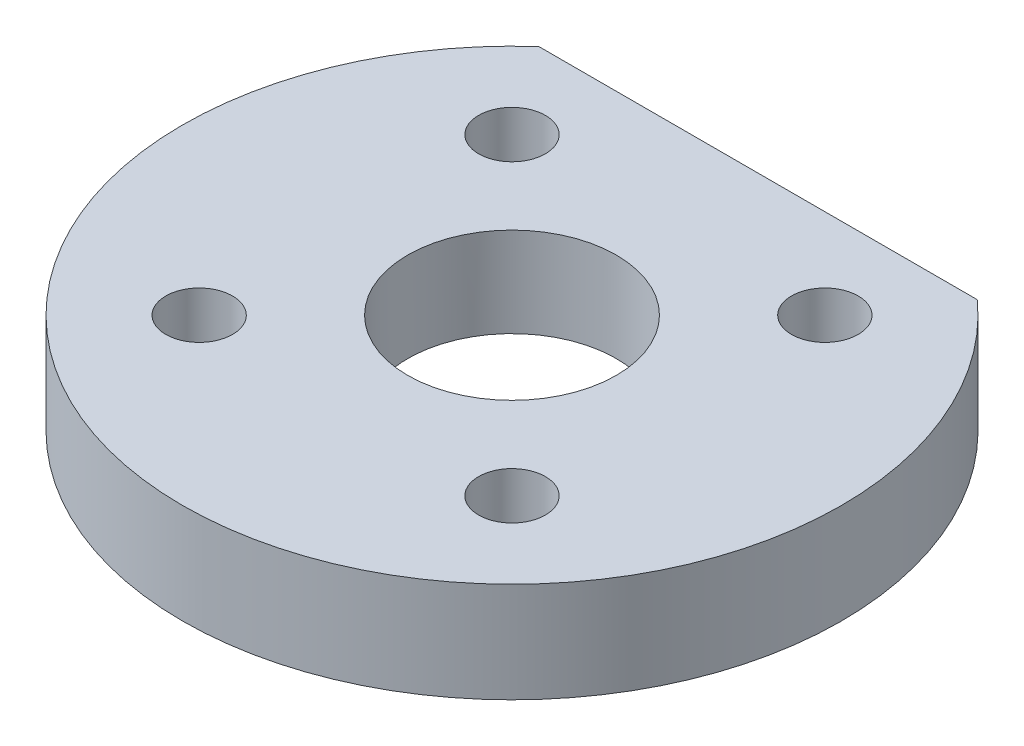
ISO-10303-21;
HEADER;
FILE_DESCRIPTION(('STEP AP214'),'2;1');
FILE_NAME('part.step','',(''),(''),'','','');
FILE_SCHEMA(('AUTOMOTIVE_DESIGN { 1 0 10303 214 1 1 1 1 }'));
ENDSEC;
DATA;
#1=APPLICATION_CONTEXT('core data for automotive mechanical design processes');
#2=APPLICATION_PROTOCOL_DEFINITION('international standard','automotive_design',2000,#1);
#3=PRODUCT_CONTEXT('',#1,'mechanical');
#4=PRODUCT('Part','Part','',(#3));
#5=PRODUCT_RELATED_PRODUCT_CATEGORY('part','',(#4));
#6=PRODUCT_DEFINITION_FORMATION('','',#4);
#7=PRODUCT_DEFINITION_CONTEXT('part definition',#1,'design');
#8=PRODUCT_DEFINITION('design','',#6,#7);
#9=PRODUCT_DEFINITION_SHAPE('','',#8);
#10=(LENGTH_UNIT() NAMED_UNIT(*) SI_UNIT(.MILLI.,.METRE.));
#11=(NAMED_UNIT(*) PLANE_ANGLE_UNIT() SI_UNIT($,.RADIAN.));
#12=(NAMED_UNIT(*) SI_UNIT($,.STERADIAN.) SOLID_ANGLE_UNIT());
#13=UNCERTAINTY_MEASURE_WITH_UNIT(LENGTH_MEASURE(1.E-05),#10,'distance_accuracy_value','');
#14=(GEOMETRIC_REPRESENTATION_CONTEXT(3) GLOBAL_UNCERTAINTY_ASSIGNED_CONTEXT((#13)) GLOBAL_UNIT_ASSIGNED_CONTEXT((#10,
#11,#12)) REPRESENTATION_CONTEXT('',''));
#15=CARTESIAN_POINT('',(0.,0.,0.));
#16=DIRECTION('',(0.,0.,1.));
#17=DIRECTION('',(1.,0.,0.));
#18=AXIS2_PLACEMENT_3D('',#15,#16,#17);
#19=CARTESIAN_POINT('',(0.,0.,0.));
#20=DIRECTION('',(0.,1.,0.));
#21=DIRECTION('',(1.,0.,0.));
#22=AXIS2_PLACEMENT_3D('',#19,#20,#21);
#23=PLANE('',#22);
#24=CARTESIAN_POINT('',(0.,0.,0.));
#25=DIRECTION('',(0.,-1.,0.));
#26=DIRECTION('',(0.665008887927277,0.,-0.746835443037974));
#27=AXIS2_PLACEMENT_3D('',#24,#25,#26);
#28=CIRCLE('',#27,15.8);
#29=CARTESIAN_POINT('',(10.50714042925,0.,-11.8));
#30=VERTEX_POINT('',#29);
#31=CARTESIAN_POINT('',(-10.50714042925,0.,-11.8));
#32=VERTEX_POINT('',#31);
#33=EDGE_CURVE('E11',#30,#32,#28,.T.);
#34=ORIENTED_EDGE('',*,*,#33,.T.);
#35=DIRECTION('',(1.,0.,0.));
#36=VECTOR('',#35,1.);
#37=CARTESIAN_POINT('',(-10.50714042925,0.,-11.8));
#38=LINE('',#37,#36);
#39=EDGE_CURVE('E27',#32,#30,#38,.T.);
#40=ORIENTED_EDGE('',*,*,#39,.T.);
#41=EDGE_LOOP('',(#34,#40));
#42=FACE_BOUND('',#41,.T.);
#43=CARTESIAN_POINT('',(-7.5,0.,-7.5));
#44=DIRECTION('',(0.,-1.,0.));
#45=DIRECTION('',(-1.,0.,0.));
#46=AXIS2_PLACEMENT_3D('',#43,#44,#45);
#47=CIRCLE('',#46,1.6);
#48=CARTESIAN_POINT('',(-9.1,0.,-7.5));
#49=VERTEX_POINT('',#48);
#50=EDGE_CURVE('E74',#49,#49,#47,.T.);
#51=ORIENTED_EDGE('',*,*,#50,.F.);
#52=EDGE_LOOP('',(#51));
#53=FACE_BOUND('',#52,.T.);
#54=CARTESIAN_POINT('',(-7.5,0.,7.5));
#55=DIRECTION('',(0.,-1.,0.));
#56=DIRECTION('',(0.,0.,1.));
#57=AXIS2_PLACEMENT_3D('',#54,#55,#56);
#58=CIRCLE('',#57,1.6);
#59=CARTESIAN_POINT('',(-7.5,0.,9.1));
#60=VERTEX_POINT('',#59);
#61=EDGE_CURVE('E218',#60,#60,#58,.T.);
#62=ORIENTED_EDGE('',*,*,#61,.F.);
#63=EDGE_LOOP('',(#62));
#64=FACE_BOUND('',#63,.T.);
#65=CARTESIAN_POINT('',(7.5,0.,7.5));
#66=DIRECTION('',(0.,-1.,0.));
#67=DIRECTION('',(1.,0.,0.));
#68=AXIS2_PLACEMENT_3D('',#65,#66,#67);
#69=CIRCLE('',#68,1.6);
#70=CARTESIAN_POINT('',(9.1,0.,7.5));
#71=VERTEX_POINT('',#70);
#72=EDGE_CURVE('E215',#71,#71,#69,.T.);
#73=ORIENTED_EDGE('',*,*,#72,.F.);
#74=EDGE_LOOP('',(#73));
#75=FACE_BOUND('',#74,.T.);
#76=CARTESIAN_POINT('',(7.5,0.,-7.5));
#77=DIRECTION('',(0.,-1.,0.));
#78=DIRECTION('',(0.,0.,-1.));
#79=AXIS2_PLACEMENT_3D('',#76,#77,#78);
#80=CIRCLE('',#79,1.6);
#81=CARTESIAN_POINT('',(7.5,0.,-9.1));
#82=VERTEX_POINT('',#81);
#83=EDGE_CURVE('E77',#82,#82,#80,.T.);
#84=ORIENTED_EDGE('',*,*,#83,.F.);
#85=EDGE_LOOP('',(#84));
#86=FACE_BOUND('',#85,.T.);
#87=CARTESIAN_POINT('',(0.,0.,0.));
#88=DIRECTION('',(0.,1.,0.));
#89=DIRECTION('',(1.,0.,0.));
#90=AXIS2_PLACEMENT_3D('',#87,#88,#89);
#91=CIRCLE('',#90,7.35);
#92=CARTESIAN_POINT('',(7.35,0.,0.));
#93=VERTEX_POINT('',#92);
#94=EDGE_CURVE('E222',#93,#93,#91,.T.);
#95=ORIENTED_EDGE('',*,*,#94,.T.);
#96=EDGE_LOOP('',(#95));
#97=FACE_BOUND('',#96,.T.);
#98=ADVANCED_FACE('F17',(#42,#53,#64,#75,#86,#97),#23,.F.);
#99=CARTESIAN_POINT('',(-10.50714042925,4.8,-11.8));
#100=DIRECTION('',(0.,0.,1.));
#101=DIRECTION('',(1.,0.,0.));
#102=AXIS2_PLACEMENT_3D('',#99,#100,#101);
#103=PLANE('',#102);
#104=DIRECTION('',(0.,1.,0.));
#105=VECTOR('',#104,1.);
#106=CARTESIAN_POINT('',(-10.50714042925,0.,-11.8));
#107=LINE('',#106,#105);
#108=CARTESIAN_POINT('',(-10.50714042925,4.8,-11.8));
#109=VERTEX_POINT('',#108);
#110=EDGE_CURVE('E53',#32,#109,#107,.T.);
#111=ORIENTED_EDGE('',*,*,#110,.T.);
#112=DIRECTION('',(1.,0.,0.));
#113=VECTOR('',#112,1.);
#114=CARTESIAN_POINT('',(-10.50714042925,4.8,-11.8));
#115=LINE('',#114,#113);
#116=CARTESIAN_POINT('',(10.50714042925,4.8,-11.8));
#117=VERTEX_POINT('',#116);
#118=EDGE_CURVE('E42',#109,#117,#115,.T.);
#119=ORIENTED_EDGE('',*,*,#118,.T.);
#120=DIRECTION('',(0.,1.,0.));
#121=VECTOR('',#120,1.);
#122=CARTESIAN_POINT('',(10.50714042925,0.,-11.8));
#123=LINE('',#122,#121);
#124=EDGE_CURVE('E47',#30,#117,#123,.T.);
#125=ORIENTED_EDGE('',*,*,#124,.F.);
#126=ORIENTED_EDGE('',*,*,#39,.F.);
#127=EDGE_LOOP('',(#111,#119,#125,#126));
#128=FACE_BOUND('',#127,.T.);
#129=ADVANCED_FACE('F52',(#128),#103,.F.);
#130=CARTESIAN_POINT('',(0.,0.,0.));
#131=DIRECTION('',(0.,1.,0.));
#132=DIRECTION('',(1.,0.,0.));
#133=AXIS2_PLACEMENT_3D('',#130,#131,#132);
#134=CYLINDRICAL_SURFACE('',#133,15.8);
#135=ORIENTED_EDGE('',*,*,#124,.T.);
#136=CARTESIAN_POINT('',(0.,4.8,0.));
#137=DIRECTION('',(0.,1.,0.));
#138=DIRECTION('',(-0.665008887927277,0.,-0.746835443037974));
#139=AXIS2_PLACEMENT_3D('',#136,#137,#138);
#140=CIRCLE('',#139,15.8);
#141=EDGE_CURVE('E50',#109,#117,#140,.T.);
#142=ORIENTED_EDGE('',*,*,#141,.F.);
#143=ORIENTED_EDGE('',*,*,#110,.F.);
#144=ORIENTED_EDGE('',*,*,#33,.F.);
#145=EDGE_LOOP('',(#135,#142,#143,#144));
#146=FACE_BOUND('',#145,.T.);
#147=ADVANCED_FACE('F48',(#146),#134,.T.);
#148=CARTESIAN_POINT('',(0.,4.8,0.));
#149=DIRECTION('',(0.,1.,0.));
#150=DIRECTION('',(1.,0.,0.));
#151=AXIS2_PLACEMENT_3D('',#148,#149,#150);
#152=PLANE('',#151);
#153=ORIENTED_EDGE('',*,*,#141,.T.);
#154=ORIENTED_EDGE('',*,*,#118,.F.);
#155=EDGE_LOOP('',(#153,#154));
#156=FACE_BOUND('',#155,.T.);
#157=CARTESIAN_POINT('',(-7.5,4.8,-7.5));
#158=DIRECTION('',(0.,-1.,0.));
#159=DIRECTION('',(-1.,0.,0.));
#160=AXIS2_PLACEMENT_3D('',#157,#158,#159);
#161=CIRCLE('',#160,1.6);
#162=CARTESIAN_POINT('',(-9.1,4.8,-7.5));
#163=VERTEX_POINT('',#162);
#164=EDGE_CURVE('E57',#163,#163,#161,.T.);
#165=ORIENTED_EDGE('',*,*,#164,.T.);
#166=EDGE_LOOP('',(#165));
#167=FACE_BOUND('',#166,.T.);
#168=CARTESIAN_POINT('',(-7.5,4.8,7.5));
#169=DIRECTION('',(0.,-1.,0.));
#170=DIRECTION('',(0.,0.,1.));
#171=AXIS2_PLACEMENT_3D('',#168,#169,#170);
#172=CIRCLE('',#171,1.6);
#173=CARTESIAN_POINT('',(-7.5,4.8,9.1));
#174=VERTEX_POINT('',#173);
#175=EDGE_CURVE('E60',#174,#174,#172,.T.);
#176=ORIENTED_EDGE('',*,*,#175,.T.);
#177=EDGE_LOOP('',(#176));
#178=FACE_BOUND('',#177,.T.);
#179=CARTESIAN_POINT('',(7.5,4.8,7.5));
#180=DIRECTION('',(0.,-1.,0.));
#181=DIRECTION('',(1.,0.,0.));
#182=AXIS2_PLACEMENT_3D('',#179,#180,#181);
#183=CIRCLE('',#182,1.6);
#184=CARTESIAN_POINT('',(9.1,4.8,7.5));
#185=VERTEX_POINT('',#184);
#186=EDGE_CURVE('E65',#185,#185,#183,.T.);
#187=ORIENTED_EDGE('',*,*,#186,.T.);
#188=EDGE_LOOP('',(#187));
#189=FACE_BOUND('',#188,.T.);
#190=CARTESIAN_POINT('',(7.5,4.8,-7.5));
#191=DIRECTION('',(0.,-1.,0.));
#192=DIRECTION('',(0.,0.,-1.));
#193=AXIS2_PLACEMENT_3D('',#190,#191,#192);
#194=CIRCLE('',#193,1.6);
#195=CARTESIAN_POINT('',(7.5,4.8,-9.1));
#196=VERTEX_POINT('',#195);
#197=EDGE_CURVE('E68',#196,#196,#194,.T.);
#198=ORIENTED_EDGE('',*,*,#197,.T.);
#199=EDGE_LOOP('',(#198));
#200=FACE_BOUND('',#199,.T.);
#201=CARTESIAN_POINT('',(0.,4.8,0.));
#202=DIRECTION('',(0.,-1.,0.));
#203=DIRECTION('',(-1.,0.,0.));
#204=AXIS2_PLACEMENT_3D('',#201,#202,#203);
#205=CIRCLE('',#204,5.);
#206=CARTESIAN_POINT('',(-5.,4.8,0.));
#207=VERTEX_POINT('',#206);
#208=EDGE_CURVE('E71',#207,#207,#205,.T.);
#209=ORIENTED_EDGE('',*,*,#208,.T.);
#210=EDGE_LOOP('',(#209));
#211=FACE_BOUND('',#210,.T.);
#212=ADVANCED_FACE('F55',(#156,#167,#178,#189,#200,#211),#152,.T.);
#213=CARTESIAN_POINT('',(-7.5,4.8,-7.5));
#214=DIRECTION('',(0.,-1.,0.));
#215=DIRECTION('',(1.,0.,0.));
#216=AXIS2_PLACEMENT_3D('',#213,#214,#215);
#217=CYLINDRICAL_SURFACE('',#216,1.6);
#218=ORIENTED_EDGE('',*,*,#50,.T.);
#219=EDGE_LOOP('',(#218));
#220=FACE_BOUND('',#219,.T.);
#221=ORIENTED_EDGE('',*,*,#164,.F.);
#222=EDGE_LOOP('',(#221));
#223=FACE_BOUND('',#222,.T.);
#224=ADVANCED_FACE('F111',(#220,#223),#217,.F.);
#225=CARTESIAN_POINT('',(-7.5,4.8,7.5));
#226=DIRECTION('',(0.,-1.,0.));
#227=DIRECTION('',(0.,0.,-1.));
#228=AXIS2_PLACEMENT_3D('',#225,#226,#227);
#229=CYLINDRICAL_SURFACE('',#228,1.6);
#230=ORIENTED_EDGE('',*,*,#61,.T.);
#231=EDGE_LOOP('',(#230));
#232=FACE_BOUND('',#231,.T.);
#233=ORIENTED_EDGE('',*,*,#175,.F.);
#234=EDGE_LOOP('',(#233));
#235=FACE_BOUND('',#234,.T.);
#236=ADVANCED_FACE('F114',(#232,#235),#229,.F.);
#237=CARTESIAN_POINT('',(7.5,4.8,7.5));
#238=DIRECTION('',(0.,-1.,0.));
#239=DIRECTION('',(-1.,0.,0.));
#240=AXIS2_PLACEMENT_3D('',#237,#238,#239);
#241=CYLINDRICAL_SURFACE('',#240,1.6);
#242=ORIENTED_EDGE('',*,*,#72,.T.);
#243=EDGE_LOOP('',(#242));
#244=FACE_BOUND('',#243,.T.);
#245=ORIENTED_EDGE('',*,*,#186,.F.);
#246=EDGE_LOOP('',(#245));
#247=FACE_BOUND('',#246,.T.);
#248=ADVANCED_FACE('F118',(#244,#247),#241,.F.);
#249=CARTESIAN_POINT('',(7.5,4.8,-7.5));
#250=DIRECTION('',(0.,-1.,0.));
#251=DIRECTION('',(0.,0.,1.));
#252=AXIS2_PLACEMENT_3D('',#249,#250,#251);
#253=CYLINDRICAL_SURFACE('',#252,1.6);
#254=ORIENTED_EDGE('',*,*,#83,.T.);
#255=EDGE_LOOP('',(#254));
#256=FACE_BOUND('',#255,.T.);
#257=ORIENTED_EDGE('',*,*,#197,.F.);
#258=EDGE_LOOP('',(#257));
#259=FACE_BOUND('',#258,.T.);
#260=ADVANCED_FACE('F122',(#256,#259),#253,.F.);
#261=CARTESIAN_POINT('',(0.,4.8,0.));
#262=DIRECTION('',(0.,-1.,0.));
#263=DIRECTION('',(1.,0.,0.));
#264=AXIS2_PLACEMENT_3D('',#261,#262,#263);
#265=CYLINDRICAL_SURFACE('',#264,5.);
#266=CARTESIAN_POINT('',(0.,0.5,0.));
#267=DIRECTION('',(0.,-1.,0.));
#268=DIRECTION('',(1.,0.,0.));
#269=AXIS2_PLACEMENT_3D('',#266,#267,#268);
#270=CIRCLE('',#269,5.);
#271=CARTESIAN_POINT('',(5.,0.5,0.));
#272=VERTEX_POINT('',#271);
#273=EDGE_CURVE('E75',#272,#272,#270,.T.);
#274=ORIENTED_EDGE('',*,*,#273,.T.);
#275=EDGE_LOOP('',(#274));
#276=FACE_BOUND('',#275,.T.);
#277=ORIENTED_EDGE('',*,*,#208,.F.);
#278=EDGE_LOOP('',(#277));
#279=FACE_BOUND('',#278,.T.);
#280=ADVANCED_FACE('F95',(#276,#279),#265,.F.);
#281=CARTESIAN_POINT('',(0.,0.5,0.));
#282=DIRECTION('',(0.,1.,0.));
#283=DIRECTION('',(-1.,0.,0.));
#284=AXIS2_PLACEMENT_3D('',#281,#282,#283);
#285=PLANE('',#284);
#286=CARTESIAN_POINT('',(0.,0.5,0.));
#287=DIRECTION('',(0.,1.,0.));
#288=DIRECTION('',(1.,0.,0.));
#289=AXIS2_PLACEMENT_3D('',#286,#287,#288);
#290=CIRCLE('',#289,6.35);
#291=CARTESIAN_POINT('',(6.35,0.5,0.));
#292=VERTEX_POINT('',#291);
#293=EDGE_CURVE('E78',#292,#292,#290,.T.);
#294=ORIENTED_EDGE('',*,*,#293,.F.);
#295=EDGE_LOOP('',(#294));
#296=FACE_BOUND('',#295,.T.);
#297=ORIENTED_EDGE('',*,*,#273,.F.);
#298=EDGE_LOOP('',(#297));
#299=FACE_BOUND('',#298,.T.);
#300=ADVANCED_FACE('F89',(#296,#299),#285,.F.);
#301=CARTESIAN_POINT('',(0.,0.266846170942,0.));
#302=DIRECTION('',(0.,-1.,0.));
#303=DIRECTION('',(0.,0.,-1.));
#304=AXIS2_PLACEMENT_3D('',#301,#302,#303);
#305=CONICAL_SURFACE('',#304,6.849999999958,1.1344640137961);
#306=CARTESIAN_POINT('',(0.,0.033692341845,0.));
#307=DIRECTION('',(0.,1.,0.));
#308=DIRECTION('',(-1.,0.,0.));
#309=AXIS2_PLACEMENT_3D('',#306,#307,#308);
#310=CIRCLE('',#309,7.35);
#311=CARTESIAN_POINT('',(-7.35,0.033692341845,0.));
#312=VERTEX_POINT('',#311);
#313=EDGE_CURVE('E21',#312,#312,#310,.T.);
#314=ORIENTED_EDGE('',*,*,#313,.F.);
#315=EDGE_LOOP('',(#314));
#316=FACE_BOUND('',#315,.T.);
#317=ORIENTED_EDGE('',*,*,#293,.T.);
#318=EDGE_LOOP('',(#317));
#319=FACE_BOUND('',#318,.T.);
#320=ADVANCED_FACE('F87',(#316,#319),#305,.F.);
#321=CARTESIAN_POINT('',(0.,0.,0.));
#322=DIRECTION('',(0.,1.,0.));
#323=DIRECTION('',(-1.,0.,0.));
#324=AXIS2_PLACEMENT_3D('',#321,#322,#323);
#325=CYLINDRICAL_SURFACE('',#324,7.35);
#326=ORIENTED_EDGE('',*,*,#313,.T.);
#327=EDGE_LOOP('',(#326));
#328=FACE_BOUND('',#327,.T.);
#329=ORIENTED_EDGE('',*,*,#94,.F.);
#330=EDGE_LOOP('',(#329));
#331=FACE_BOUND('',#330,.T.);
#332=ADVANCED_FACE('F19',(#328,#331),#325,.F.);
#333=CLOSED_SHELL('',(#98,#129,#147,#212,#224,#236,#248,#260,#280,#300,#320,#332));
#334=MANIFOLD_SOLID_BREP('B1',#333);
#335=ADVANCED_BREP_SHAPE_REPRESENTATION('',(#18,#334),#14);
#336=SHAPE_DEFINITION_REPRESENTATION(#9,#335);
ENDSEC;
END-ISO-10303-21;
